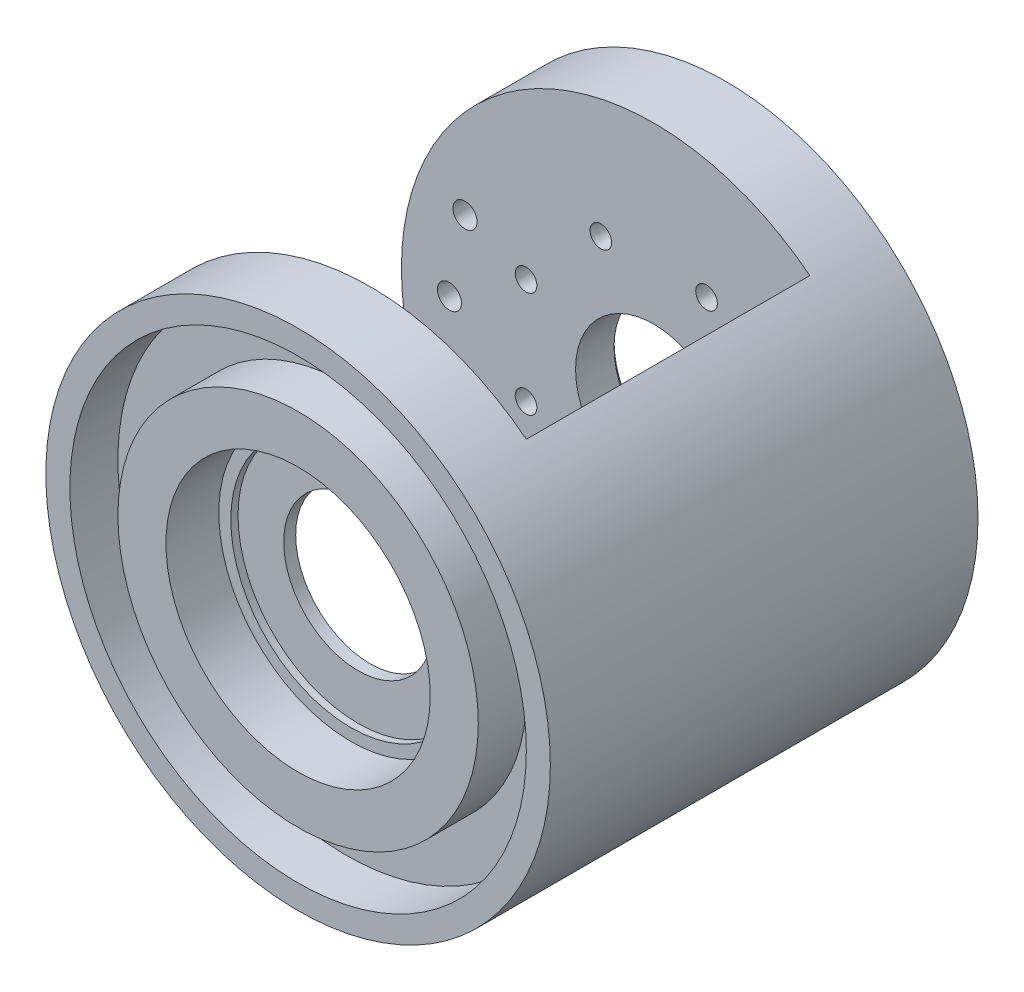
ISO-10303-21;
HEADER;
FILE_DESCRIPTION(('STEP AP214'),'2;1');
FILE_NAME('part.step','',(''),(''),'','','');
FILE_SCHEMA(('AUTOMOTIVE_DESIGN { 1 0 10303 214 1 1 1 1 }'));
ENDSEC;
DATA;
#1=APPLICATION_CONTEXT('core data for automotive mechanical design processes');
#2=APPLICATION_PROTOCOL_DEFINITION('international standard','automotive_design',2000,#1);
#3=PRODUCT_CONTEXT('',#1,'mechanical');
#4=PRODUCT('Part','Part','',(#3));
#5=PRODUCT_RELATED_PRODUCT_CATEGORY('part','',(#4));
#6=PRODUCT_DEFINITION_FORMATION('','',#4);
#7=PRODUCT_DEFINITION_CONTEXT('part definition',#1,'design');
#8=PRODUCT_DEFINITION('design','',#6,#7);
#9=PRODUCT_DEFINITION_SHAPE('','',#8);
#10=(LENGTH_UNIT() NAMED_UNIT(*) SI_UNIT(.MILLI.,.METRE.));
#11=(NAMED_UNIT(*) PLANE_ANGLE_UNIT() SI_UNIT($,.RADIAN.));
#12=(NAMED_UNIT(*) SI_UNIT($,.STERADIAN.) SOLID_ANGLE_UNIT());
#13=UNCERTAINTY_MEASURE_WITH_UNIT(LENGTH_MEASURE(1.E-05),#10,'distance_accuracy_value','');
#14=(GEOMETRIC_REPRESENTATION_CONTEXT(3) GLOBAL_UNCERTAINTY_ASSIGNED_CONTEXT((#13)) GLOBAL_UNIT_ASSIGNED_CONTEXT((#10,
#11,#12)) REPRESENTATION_CONTEXT('',''));
#15=CARTESIAN_POINT('',(0.,0.,0.));
#16=DIRECTION('',(0.,0.,1.));
#17=DIRECTION('',(1.,0.,0.));
#18=AXIS2_PLACEMENT_3D('',#15,#16,#17);
#19=CARTESIAN_POINT('',(0.,0.,178.));
#20=DIRECTION('',(0.,0.,-1.));
#21=DIRECTION('',(-1.,0.,0.));
#22=AXIS2_PLACEMENT_3D('',#19,#20,#21);
#23=CYLINDRICAL_SURFACE('',#22,105.);
#24=CARTESIAN_POINT('',(0.,0.,0.));
#25=DIRECTION('',(0.,0.,1.));
#26=DIRECTION('',(1.,0.,0.));
#27=AXIS2_PLACEMENT_3D('',#24,#25,#26);
#28=CIRCLE('',#27,105.);
#29=CARTESIAN_POINT('',(105.,0.,0.));
#30=VERTEX_POINT('',#29);
#31=EDGE_CURVE('E170',#30,#30,#28,.T.);
#32=ORIENTED_EDGE('',*,*,#31,.T.);
#33=EDGE_LOOP('',(#32));
#34=FACE_BOUND('',#33,.T.);
#35=CARTESIAN_POINT('',(0.,0.,178.));
#36=DIRECTION('',(0.,0.,1.));
#37=DIRECTION('',(1.,0.,0.));
#38=AXIS2_PLACEMENT_3D('',#35,#36,#37);
#39=CIRCLE('',#38,105.);
#40=CARTESIAN_POINT('',(105.,0.,178.));
#41=VERTEX_POINT('',#40);
#42=EDGE_CURVE('E173',#41,#41,#39,.T.);
#43=ORIENTED_EDGE('',*,*,#42,.F.);
#44=EDGE_LOOP('',(#43));
#45=FACE_BOUND('',#44,.T.);
#46=CARTESIAN_POINT('',(0.,0.,148.));
#47=DIRECTION('',(0.,0.,-1.));
#48=DIRECTION('',(-1.,0.,0.));
#49=AXIS2_PLACEMENT_3D('',#46,#47,#48);
#50=CIRCLE('',#49,105.);
#51=CARTESIAN_POINT('',(65.,-82.4621125123532,148.));
#52=VERTEX_POINT('',#51);
#53=CARTESIAN_POINT('',(65.,82.4621125123532,148.));
#54=VERTEX_POINT('',#53);
#55=EDGE_CURVE('E72',#52,#54,#50,.T.);
#56=ORIENTED_EDGE('',*,*,#55,.F.);
#57=DIRECTION('',(0.,0.,-1.));
#58=VECTOR('',#57,1.);
#59=CARTESIAN_POINT('',(65.,-82.4621125123532,148.));
#60=LINE('',#59,#58);
#61=CARTESIAN_POINT('',(65.,-82.4621125123532,30.));
#62=VERTEX_POINT('',#61);
#63=EDGE_CURVE('E60',#52,#62,#60,.T.);
#64=ORIENTED_EDGE('',*,*,#63,.T.);
#65=CARTESIAN_POINT('',(0.,0.,30.));
#66=DIRECTION('',(0.,0.,-1.));
#67=DIRECTION('',(-1.,0.,0.));
#68=AXIS2_PLACEMENT_3D('',#65,#66,#67);
#69=CIRCLE('',#68,105.);
#70=CARTESIAN_POINT('',(65.,82.4621125123532,30.));
#71=VERTEX_POINT('',#70);
#72=EDGE_CURVE('E64',#62,#71,#69,.T.);
#73=ORIENTED_EDGE('',*,*,#72,.T.);
#74=DIRECTION('',(0.,0.,-1.));
#75=VECTOR('',#74,1.);
#76=CARTESIAN_POINT('',(65.,82.4621125123532,148.));
#77=LINE('',#76,#75);
#78=EDGE_CURVE('E62',#54,#71,#77,.T.);
#79=ORIENTED_EDGE('',*,*,#78,.F.);
#80=EDGE_LOOP('',(#56,#64,#73,#79));
#81=FACE_BOUND('',#80,.T.);
#82=ADVANCED_FACE('F32',(#34,#45,#81),#23,.T.);
#83=CARTESIAN_POINT('',(0.,0.,130.));
#84=DIRECTION('',(0.,0.,1.));
#85=DIRECTION('',(1.,0.,0.));
#86=AXIS2_PLACEMENT_3D('',#83,#84,#85);
#87=CYLINDRICAL_SURFACE('',#86,31.);
#88=CARTESIAN_POINT('',(0.,0.,153.));
#89=DIRECTION('',(0.,0.,1.));
#90=DIRECTION('',(1.,0.,0.));
#91=AXIS2_PLACEMENT_3D('',#88,#89,#90);
#92=CIRCLE('',#91,31.);
#93=CARTESIAN_POINT('',(31.,0.,153.));
#94=VERTEX_POINT('',#93);
#95=EDGE_CURVE('E143',#94,#94,#92,.T.);
#96=ORIENTED_EDGE('',*,*,#95,.T.);
#97=EDGE_LOOP('',(#96));
#98=FACE_BOUND('',#97,.T.);
#99=CARTESIAN_POINT('',(0.,0.,148.));
#100=DIRECTION('',(0.,0.,-1.));
#101=DIRECTION('',(-1.,0.,0.));
#102=AXIS2_PLACEMENT_3D('',#99,#100,#101);
#103=CIRCLE('',#102,31.);
#104=CARTESIAN_POINT('',(-31.,0.,148.));
#105=VERTEX_POINT('',#104);
#106=EDGE_CURVE('E102',#105,#105,#103,.F.);
#107=ORIENTED_EDGE('',*,*,#106,.F.);
#108=EDGE_LOOP('',(#107));
#109=FACE_BOUND('',#108,.T.);
#110=ADVANCED_FACE('F209',(#98,#109),#87,.F.);
#111=CARTESIAN_POINT('',(0.,0.,178.));
#112=DIRECTION('',(0.,0.,1.));
#113=DIRECTION('',(1.,0.,0.));
#114=AXIS2_PLACEMENT_3D('',#111,#112,#113);
#115=PLANE('',#114);
#116=CARTESIAN_POINT('',(0.,0.,178.));
#117=DIRECTION('',(0.,0.,1.));
#118=DIRECTION('',(1.,0.,0.));
#119=AXIS2_PLACEMENT_3D('',#116,#117,#118);
#120=CIRCLE('',#119,95.);
#121=CARTESIAN_POINT('',(95.,0.,178.));
#122=VERTEX_POINT('',#121);
#123=EDGE_CURVE('E164',#122,#122,#120,.T.);
#124=ORIENTED_EDGE('',*,*,#123,.F.);
#125=EDGE_LOOP('',(#124));
#126=FACE_BOUND('',#125,.T.);
#127=ORIENTED_EDGE('',*,*,#42,.T.);
#128=EDGE_LOOP('',(#127));
#129=FACE_BOUND('',#128,.T.);
#130=ADVANCED_FACE('F214',(#126,#129),#115,.T.);
#131=CARTESIAN_POINT('',(0.,0.,0.));
#132=DIRECTION('',(0.,0.,1.));
#133=DIRECTION('',(1.,0.,0.));
#134=AXIS2_PLACEMENT_3D('',#131,#132,#133);
#135=PLANE('',#134);
#136=CARTESIAN_POINT('',(0.,0.,0.));
#137=DIRECTION('',(0.,0.,-1.));
#138=DIRECTION('',(-1.,0.,0.));
#139=AXIS2_PLACEMENT_3D('',#136,#137,#138);
#140=CIRCLE('',#139,95.);
#141=CARTESIAN_POINT('',(-95.,0.,0.));
#142=VERTEX_POINT('',#141);
#143=EDGE_CURVE('E137',#142,#142,#140,.T.);
#144=ORIENTED_EDGE('',*,*,#143,.F.);
#145=EDGE_LOOP('',(#144));
#146=FACE_BOUND('',#145,.T.);
#147=ORIENTED_EDGE('',*,*,#31,.F.);
#148=EDGE_LOOP('',(#147));
#149=FACE_BOUND('',#148,.T.);
#150=ADVANCED_FACE('F219',(#146,#149),#135,.F.);
#151=CARTESIAN_POINT('',(0.,0.,158.));
#152=DIRECTION('',(0.,0.,1.));
#153=DIRECTION('',(1.,0.,0.));
#154=AXIS2_PLACEMENT_3D('',#151,#152,#153);
#155=CYLINDRICAL_SURFACE('',#154,95.);
#156=CARTESIAN_POINT('',(0.,0.,158.));
#157=DIRECTION('',(0.,0.,1.));
#158=DIRECTION('',(1.,0.,0.));
#159=AXIS2_PLACEMENT_3D('',#156,#157,#158);
#160=CIRCLE('',#159,95.);
#161=CARTESIAN_POINT('',(95.,0.,158.));
#162=VERTEX_POINT('',#161);
#163=EDGE_CURVE('E167',#162,#162,#160,.T.);
#164=ORIENTED_EDGE('',*,*,#163,.F.);
#165=EDGE_LOOP('',(#164));
#166=FACE_BOUND('',#165,.T.);
#167=ORIENTED_EDGE('',*,*,#123,.T.);
#168=EDGE_LOOP('',(#167));
#169=FACE_BOUND('',#168,.T.);
#170=ADVANCED_FACE('F222',(#166,#169),#155,.F.);
#171=CARTESIAN_POINT('',(0.,0.,158.));
#172=DIRECTION('',(0.,0.,1.));
#173=DIRECTION('',(1.,0.,0.));
#174=AXIS2_PLACEMENT_3D('',#171,#172,#173);
#175=PLANE('',#174);
#176=CARTESIAN_POINT('',(0.,0.,158.));
#177=DIRECTION('',(0.,0.,1.));
#178=DIRECTION('',(1.,0.,0.));
#179=AXIS2_PLACEMENT_3D('',#176,#177,#178);
#180=CIRCLE('',#179,75.);
#181=CARTESIAN_POINT('',(75.,0.,158.));
#182=VERTEX_POINT('',#181);
#183=EDGE_CURVE('E161',#182,#182,#180,.T.);
#184=ORIENTED_EDGE('',*,*,#183,.F.);
#185=EDGE_LOOP('',(#184));
#186=FACE_BOUND('',#185,.T.);
#187=ORIENTED_EDGE('',*,*,#163,.T.);
#188=EDGE_LOOP('',(#187));
#189=FACE_BOUND('',#188,.T.);
#190=ADVANCED_FACE('F231',(#186,#189),#175,.T.);
#191=CARTESIAN_POINT('',(0.,0.,158.));
#192=DIRECTION('',(0.,0.,1.));
#193=DIRECTION('',(1.,0.,0.));
#194=AXIS2_PLACEMENT_3D('',#191,#192,#193);
#195=CYLINDRICAL_SURFACE('',#194,75.);
#196=ORIENTED_EDGE('',*,*,#183,.T.);
#197=EDGE_LOOP('',(#196));
#198=FACE_BOUND('',#197,.T.);
#199=CARTESIAN_POINT('',(0.,0.,178.));
#200=DIRECTION('',(0.,0.,1.));
#201=DIRECTION('',(1.,0.,0.));
#202=AXIS2_PLACEMENT_3D('',#199,#200,#201);
#203=CIRCLE('',#202,75.);
#204=CARTESIAN_POINT('',(75.,0.,178.));
#205=VERTEX_POINT('',#204);
#206=EDGE_CURVE('E158',#205,#205,#203,.T.);
#207=ORIENTED_EDGE('',*,*,#206,.F.);
#208=EDGE_LOOP('',(#207));
#209=FACE_BOUND('',#208,.T.);
#210=ADVANCED_FACE('F235',(#198,#209),#195,.T.);
#211=CARTESIAN_POINT('',(0.,0.,178.));
#212=DIRECTION('',(0.,0.,1.));
#213=DIRECTION('',(1.,0.,0.));
#214=AXIS2_PLACEMENT_3D('',#211,#212,#213);
#215=CIRCLE('',#214,55.);
#216=CARTESIAN_POINT('',(55.,0.,178.));
#217=VERTEX_POINT('',#216);
#218=EDGE_CURVE('E152',#217,#217,#215,.T.);
#219=ORIENTED_EDGE('',*,*,#218,.F.);
#220=EDGE_LOOP('',(#219));
#221=FACE_BOUND('',#220,.T.);
#222=ORIENTED_EDGE('',*,*,#206,.T.);
#223=EDGE_LOOP('',(#222));
#224=FACE_BOUND('',#223,.T.);
#225=ADVANCED_FACE('F228',(#221,#224),#115,.T.);
#226=CARTESIAN_POINT('',(0.,0.,156.));
#227=DIRECTION('',(0.,0.,1.));
#228=DIRECTION('',(1.,0.,0.));
#229=AXIS2_PLACEMENT_3D('',#226,#227,#228);
#230=CYLINDRICAL_SURFACE('',#229,55.);
#231=CARTESIAN_POINT('',(0.,0.,156.));
#232=DIRECTION('',(0.,0.,1.));
#233=DIRECTION('',(1.,0.,0.));
#234=AXIS2_PLACEMENT_3D('',#231,#232,#233);
#235=CIRCLE('',#234,55.);
#236=CARTESIAN_POINT('',(55.,0.,156.));
#237=VERTEX_POINT('',#236);
#238=EDGE_CURVE('E155',#237,#237,#235,.T.);
#239=ORIENTED_EDGE('',*,*,#238,.F.);
#240=EDGE_LOOP('',(#239));
#241=FACE_BOUND('',#240,.T.);
#242=ORIENTED_EDGE('',*,*,#218,.T.);
#243=EDGE_LOOP('',(#242));
#244=FACE_BOUND('',#243,.T.);
#245=ADVANCED_FACE('F240',(#241,#244),#230,.F.);
#246=CARTESIAN_POINT('',(0.,0.,156.));
#247=DIRECTION('',(0.,0.,1.));
#248=DIRECTION('',(1.,0.,0.));
#249=AXIS2_PLACEMENT_3D('',#246,#247,#248);
#250=PLANE('',#249);
#251=CARTESIAN_POINT('',(0.,0.,156.));
#252=DIRECTION('',(0.,0.,1.));
#253=DIRECTION('',(1.,0.,0.));
#254=AXIS2_PLACEMENT_3D('',#251,#252,#253);
#255=CIRCLE('',#254,50.);
#256=CARTESIAN_POINT('',(50.,0.,156.));
#257=VERTEX_POINT('',#256);
#258=EDGE_CURVE('E148',#257,#257,#255,.T.);
#259=ORIENTED_EDGE('',*,*,#258,.F.);
#260=EDGE_LOOP('',(#259));
#261=FACE_BOUND('',#260,.T.);
#262=ORIENTED_EDGE('',*,*,#238,.T.);
#263=EDGE_LOOP('',(#262));
#264=FACE_BOUND('',#263,.T.);
#265=ADVANCED_FACE('F243',(#261,#264),#250,.T.);
#266=CARTESIAN_POINT('',(0.,0.,153.));
#267=DIRECTION('',(0.,0.,1.));
#268=DIRECTION('',(1.,0.,0.));
#269=AXIS2_PLACEMENT_3D('',#266,#267,#268);
#270=CYLINDRICAL_SURFACE('',#269,50.);
#271=CARTESIAN_POINT('',(0.,0.,153.));
#272=DIRECTION('',(0.,0.,1.));
#273=DIRECTION('',(1.,0.,0.));
#274=AXIS2_PLACEMENT_3D('',#271,#272,#273);
#275=CIRCLE('',#274,50.);
#276=CARTESIAN_POINT('',(50.,0.,153.));
#277=VERTEX_POINT('',#276);
#278=EDGE_CURVE('E149',#277,#277,#275,.T.);
#279=ORIENTED_EDGE('',*,*,#278,.F.);
#280=EDGE_LOOP('',(#279));
#281=FACE_BOUND('',#280,.T.);
#282=ORIENTED_EDGE('',*,*,#258,.T.);
#283=EDGE_LOOP('',(#282));
#284=FACE_BOUND('',#283,.T.);
#285=ADVANCED_FACE('F247',(#281,#284),#270,.F.);
#286=CARTESIAN_POINT('',(0.,0.,153.));
#287=DIRECTION('',(0.,0.,1.));
#288=DIRECTION('',(1.,0.,0.));
#289=AXIS2_PLACEMENT_3D('',#286,#287,#288);
#290=PLANE('',#289);
#291=ORIENTED_EDGE('',*,*,#95,.F.);
#292=EDGE_LOOP('',(#291));
#293=FACE_BOUND('',#292,.T.);
#294=ORIENTED_EDGE('',*,*,#278,.T.);
#295=EDGE_LOOP('',(#294));
#296=FACE_BOUND('',#295,.T.);
#297=ADVANCED_FACE('F251',(#293,#296),#290,.T.);
#298=CARTESIAN_POINT('',(0.,0.,20.));
#299=DIRECTION('',(0.,0.,-1.));
#300=DIRECTION('',(-1.,0.,0.));
#301=AXIS2_PLACEMENT_3D('',#298,#299,#300);
#302=CYLINDRICAL_SURFACE('',#301,95.);
#303=CARTESIAN_POINT('',(0.,0.,20.));
#304=DIRECTION('',(0.,0.,-1.));
#305=DIRECTION('',(-1.,0.,0.));
#306=AXIS2_PLACEMENT_3D('',#303,#304,#305);
#307=CIRCLE('',#306,95.);
#308=CARTESIAN_POINT('',(-95.,0.,20.));
#309=VERTEX_POINT('',#308);
#310=EDGE_CURVE('E140',#309,#309,#307,.T.);
#311=ORIENTED_EDGE('',*,*,#310,.F.);
#312=EDGE_LOOP('',(#311));
#313=FACE_BOUND('',#312,.T.);
#314=ORIENTED_EDGE('',*,*,#143,.T.);
#315=EDGE_LOOP('',(#314));
#316=FACE_BOUND('',#315,.T.);
#317=ADVANCED_FACE('F254',(#313,#316),#302,.F.);
#318=CARTESIAN_POINT('',(0.,0.,20.));
#319=DIRECTION('',(0.,0.,-1.));
#320=DIRECTION('',(-1.,0.,0.));
#321=AXIS2_PLACEMENT_3D('',#318,#319,#320);
#322=PLANE('',#321);
#323=CARTESIAN_POINT('',(-78.5297602634595,-32.5280917510324,20.));
#324=DIRECTION('',(0.,0.,-1.));
#325=DIRECTION('',(-1.,0.,0.));
#326=AXIS2_PLACEMENT_3D('',#323,#324,#325);
#327=CIRCLE('',#326,5.00000000000001);
#328=CARTESIAN_POINT('',(-83.5297602634595,-32.5280917510324,20.));
#329=VERTEX_POINT('',#328);
#330=EDGE_CURVE('E189',#329,#329,#327,.T.);
#331=ORIENTED_EDGE('',*,*,#330,.F.);
#332=EDGE_LOOP('',(#331));
#333=FACE_BOUND('',#332,.T.);
#334=CARTESIAN_POINT('',(-78.5297602634595,32.5280917510324,20.));
#335=DIRECTION('',(0.,0.,-1.));
#336=DIRECTION('',(-1.,0.,0.));
#337=AXIS2_PLACEMENT_3D('',#334,#335,#336);
#338=CIRCLE('',#337,5.00000000000001);
#339=CARTESIAN_POINT('',(-83.5297602634595,32.5280917510324,20.));
#340=VERTEX_POINT('',#339);
#341=EDGE_CURVE('E185',#340,#340,#338,.T.);
#342=ORIENTED_EDGE('',*,*,#341,.F.);
#343=EDGE_LOOP('',(#342));
#344=FACE_BOUND('',#343,.T.);
#345=CARTESIAN_POINT('',(-85.,0.,20.));
#346=DIRECTION('',(0.,0.,-1.));
#347=DIRECTION('',(-1.,0.,0.));
#348=AXIS2_PLACEMENT_3D('',#345,#346,#347);
#349=CIRCLE('',#348,5.);
#350=CARTESIAN_POINT('',(-90.,0.,20.));
#351=VERTEX_POINT('',#350);
#352=EDGE_CURVE('E69',#351,#351,#349,.T.);
#353=ORIENTED_EDGE('',*,*,#352,.F.);
#354=EDGE_LOOP('',(#353));
#355=FACE_BOUND('',#354,.T.);
#356=CARTESIAN_POINT('',(0.,0.,20.));
#357=DIRECTION('',(0.,0.,-1.));
#358=DIRECTION('',(-1.,0.,0.));
#359=AXIS2_PLACEMENT_3D('',#356,#357,#358);
#360=CIRCLE('',#359,75.);
#361=CARTESIAN_POINT('',(-75.,0.,20.));
#362=VERTEX_POINT('',#361);
#363=EDGE_CURVE('E134',#362,#362,#360,.T.);
#364=ORIENTED_EDGE('',*,*,#363,.F.);
#365=EDGE_LOOP('',(#364));
#366=FACE_BOUND('',#365,.T.);
#367=ORIENTED_EDGE('',*,*,#310,.T.);
#368=EDGE_LOOP('',(#367));
#369=FACE_BOUND('',#368,.T.);
#370=ADVANCED_FACE('F259',(#333,#344,#355,#366,#369),#322,.T.);
#371=CARTESIAN_POINT('',(0.,0.,20.));
#372=DIRECTION('',(0.,0.,-1.));
#373=DIRECTION('',(-1.,0.,0.));
#374=AXIS2_PLACEMENT_3D('',#371,#372,#373);
#375=CYLINDRICAL_SURFACE('',#374,75.);
#376=ORIENTED_EDGE('',*,*,#363,.T.);
#377=EDGE_LOOP('',(#376));
#378=FACE_BOUND('',#377,.T.);
#379=CARTESIAN_POINT('',(0.,0.,0.));
#380=DIRECTION('',(0.,0.,-1.));
#381=DIRECTION('',(-1.,0.,0.));
#382=AXIS2_PLACEMENT_3D('',#379,#380,#381);
#383=CIRCLE('',#382,75.);
#384=CARTESIAN_POINT('',(-75.,0.,0.));
#385=VERTEX_POINT('',#384);
#386=EDGE_CURVE('E131',#385,#385,#383,.T.);
#387=ORIENTED_EDGE('',*,*,#386,.F.);
#388=EDGE_LOOP('',(#387));
#389=FACE_BOUND('',#388,.T.);
#390=ADVANCED_FACE('F263',(#378,#389),#375,.T.);
#391=CARTESIAN_POINT('',(0.,0.,0.));
#392=DIRECTION('',(0.,0.,-1.));
#393=DIRECTION('',(-1.,0.,0.));
#394=AXIS2_PLACEMENT_3D('',#391,#392,#393);
#395=CIRCLE('',#394,67.5);
#396=CARTESIAN_POINT('',(-67.5,0.,0.));
#397=VERTEX_POINT('',#396);
#398=EDGE_CURVE('E127',#397,#397,#395,.T.);
#399=ORIENTED_EDGE('',*,*,#398,.F.);
#400=EDGE_LOOP('',(#399));
#401=FACE_BOUND('',#400,.T.);
#402=ORIENTED_EDGE('',*,*,#386,.T.);
#403=EDGE_LOOP('',(#402));
#404=FACE_BOUND('',#403,.T.);
#405=ADVANCED_FACE('F224',(#401,#404),#135,.F.);
#406=CARTESIAN_POINT('',(0.,0.,12.));
#407=DIRECTION('',(0.,0.,-1.));
#408=DIRECTION('',(-1.,0.,0.));
#409=AXIS2_PLACEMENT_3D('',#406,#407,#408);
#410=CYLINDRICAL_SURFACE('',#409,67.5);
#411=CARTESIAN_POINT('',(0.,0.,12.));
#412=DIRECTION('',(0.,0.,-1.));
#413=DIRECTION('',(-1.,0.,0.));
#414=AXIS2_PLACEMENT_3D('',#411,#412,#413);
#415=CIRCLE('',#414,67.5);
#416=CARTESIAN_POINT('',(-67.5,0.,12.));
#417=VERTEX_POINT('',#416);
#418=EDGE_CURVE('E128',#417,#417,#415,.T.);
#419=ORIENTED_EDGE('',*,*,#418,.F.);
#420=EDGE_LOOP('',(#419));
#421=FACE_BOUND('',#420,.T.);
#422=ORIENTED_EDGE('',*,*,#398,.T.);
#423=EDGE_LOOP('',(#422));
#424=FACE_BOUND('',#423,.T.);
#425=ADVANCED_FACE('F268',(#421,#424),#410,.F.);
#426=CARTESIAN_POINT('',(0.,0.,12.));
#427=DIRECTION('',(0.,0.,-1.));
#428=DIRECTION('',(-1.,0.,0.));
#429=AXIS2_PLACEMENT_3D('',#426,#427,#428);
#430=PLANE('',#429);
#431=CARTESIAN_POINT('',(0.,0.,12.));
#432=DIRECTION('',(0.,0.,-1.));
#433=DIRECTION('',(-1.,0.,0.));
#434=AXIS2_PLACEMENT_3D('',#431,#432,#433);
#435=CIRCLE('',#434,34.5);
#436=CARTESIAN_POINT('',(-34.5,0.,12.));
#437=VERTEX_POINT('',#436);
#438=EDGE_CURVE('E11',#437,#437,#435,.F.);
#439=ORIENTED_EDGE('',*,*,#438,.T.);
#440=EDGE_LOOP('',(#439));
#441=FACE_BOUND('',#440,.T.);
#442=CARTESIAN_POINT('',(22.004297360992,53.1230731193993,12.));
#443=DIRECTION('',(0.,0.,-1.));
#444=DIRECTION('',(-1.,0.,0.));
#445=AXIS2_PLACEMENT_3D('',#442,#443,#444);
#446=CIRCLE('',#445,4.50000000000001);
#447=CARTESIAN_POINT('',(17.504297360992,53.1230731193993,12.));
#448=VERTEX_POINT('',#447);
#449=EDGE_CURVE('E103',#448,#448,#446,.T.);
#450=ORIENTED_EDGE('',*,*,#449,.F.);
#451=EDGE_LOOP('',(#450));
#452=FACE_BOUND('',#451,.T.);
#453=CARTESIAN_POINT('',(53.1230731193985,22.0042973609916,12.));
#454=DIRECTION('',(0.,0.,-1.));
#455=DIRECTION('',(-1.,0.,0.));
#456=AXIS2_PLACEMENT_3D('',#453,#454,#455);
#457=CIRCLE('',#456,4.50000000000167);
#458=CARTESIAN_POINT('',(48.6230731193968,22.0042973609916,12.));
#459=VERTEX_POINT('',#458);
#460=EDGE_CURVE('E106',#459,#459,#457,.T.);
#461=ORIENTED_EDGE('',*,*,#460,.F.);
#462=EDGE_LOOP('',(#461));
#463=FACE_BOUND('',#462,.T.);
#464=CARTESIAN_POINT('',(53.1230731193979,-22.0042973609937,12.));
#465=DIRECTION('',(0.,0.,-1.));
#466=DIRECTION('',(-1.,0.,0.));
#467=AXIS2_PLACEMENT_3D('',#464,#465,#466);
#468=CIRCLE('',#467,4.5000000000019);
#469=CARTESIAN_POINT('',(48.623073119396,-22.0042973609937,12.));
#470=VERTEX_POINT('',#469);
#471=EDGE_CURVE('E109',#470,#470,#468,.T.);
#472=ORIENTED_EDGE('',*,*,#471,.F.);
#473=EDGE_LOOP('',(#472));
#474=FACE_BOUND('',#473,.T.);
#475=CARTESIAN_POINT('',(22.0042973609912,-53.1230731193996,12.));
#476=DIRECTION('',(0.,0.,-1.));
#477=DIRECTION('',(-1.,0.,0.));
#478=AXIS2_PLACEMENT_3D('',#475,#476,#477);
#479=CIRCLE('',#478,4.50000000000162);
#480=CARTESIAN_POINT('',(17.5042973609895,-53.1230731193996,12.));
#481=VERTEX_POINT('',#480);
#482=EDGE_CURVE('E112',#481,#481,#479,.T.);
#483=ORIENTED_EDGE('',*,*,#482,.F.);
#484=EDGE_LOOP('',(#483));
#485=FACE_BOUND('',#484,.T.);
#486=CARTESIAN_POINT('',(-22.0042973609942,-53.123073119399,12.));
#487=DIRECTION('',(0.,0.,-1.));
#488=DIRECTION('',(-1.,0.,0.));
#489=AXIS2_PLACEMENT_3D('',#486,#487,#488);
#490=CIRCLE('',#489,4.50000000000098);
#491=CARTESIAN_POINT('',(-26.5042973609951,-53.123073119399,12.));
#492=VERTEX_POINT('',#491);
#493=EDGE_CURVE('E115',#492,#492,#490,.T.);
#494=ORIENTED_EDGE('',*,*,#493,.F.);
#495=EDGE_LOOP('',(#494));
#496=FACE_BOUND('',#495,.T.);
#497=CARTESIAN_POINT('',(-53.1230731194001,-22.0042973609923,12.));
#498=DIRECTION('',(0.,0.,-1.));
#499=DIRECTION('',(-1.,0.,0.));
#500=AXIS2_PLACEMENT_3D('',#497,#498,#499);
#501=CIRCLE('',#500,4.50000000000028);
#502=CARTESIAN_POINT('',(-57.6230731194003,-22.0042973609923,12.));
#503=VERTEX_POINT('',#502);
#504=EDGE_CURVE('E118',#503,#503,#501,.T.);
#505=ORIENTED_EDGE('',*,*,#504,.F.);
#506=EDGE_LOOP('',(#505));
#507=FACE_BOUND('',#506,.T.);
#508=CARTESIAN_POINT('',(-53.123073119399,22.0042973609925,12.));
#509=DIRECTION('',(0.,0.,-1.));
#510=DIRECTION('',(-1.,0.,0.));
#511=AXIS2_PLACEMENT_3D('',#508,#509,#510);
#512=CIRCLE('',#511,4.5);
#513=CARTESIAN_POINT('',(-57.623073119399,22.0042973609925,12.));
#514=VERTEX_POINT('',#513);
#515=EDGE_CURVE('E121',#514,#514,#512,.T.);
#516=ORIENTED_EDGE('',*,*,#515,.F.);
#517=EDGE_LOOP('',(#516));
#518=FACE_BOUND('',#517,.T.);
#519=CARTESIAN_POINT('',(-22.0042973609927,53.123073119399,12.));
#520=DIRECTION('',(0.,0.,-1.));
#521=DIRECTION('',(-1.,0.,0.));
#522=AXIS2_PLACEMENT_3D('',#519,#520,#521);
#523=CIRCLE('',#522,4.5);
#524=CARTESIAN_POINT('',(-26.5042973609927,53.123073119399,12.));
#525=VERTEX_POINT('',#524);
#526=EDGE_CURVE('E124',#525,#525,#523,.T.);
#527=ORIENTED_EDGE('',*,*,#526,.F.);
#528=EDGE_LOOP('',(#527));
#529=FACE_BOUND('',#528,.T.);
#530=ORIENTED_EDGE('',*,*,#418,.T.);
#531=EDGE_LOOP('',(#530));
#532=FACE_BOUND('',#531,.T.);
#533=ADVANCED_FACE('F271',(#441,#452,#463,#474,#485,#496,#507,#518,#529,#532),#430,.T.);
#534=CARTESIAN_POINT('',(0.,0.,32.));
#535=DIRECTION('',(0.,0.,-1.));
#536=DIRECTION('',(-1.,0.,0.));
#537=AXIS2_PLACEMENT_3D('',#534,#535,#536);
#538=CYLINDRICAL_SURFACE('',#537,32.5);
#539=CARTESIAN_POINT('',(0.,0.,14.));
#540=DIRECTION('',(0.,0.,-1.));
#541=DIRECTION('',(-1.,0.,0.));
#542=AXIS2_PLACEMENT_3D('',#539,#540,#541);
#543=CIRCLE('',#542,32.5);
#544=CARTESIAN_POINT('',(-32.5,0.,14.));
#545=VERTEX_POINT('',#544);
#546=EDGE_CURVE('E40',#545,#545,#543,.T.);
#547=ORIENTED_EDGE('',*,*,#546,.T.);
#548=EDGE_LOOP('',(#547));
#549=FACE_BOUND('',#548,.T.);
#550=CARTESIAN_POINT('',(0.,0.,30.));
#551=DIRECTION('',(0.,0.,-1.));
#552=DIRECTION('',(-1.,0.,0.));
#553=AXIS2_PLACEMENT_3D('',#550,#551,#552);
#554=CIRCLE('',#553,32.5);
#555=CARTESIAN_POINT('',(-32.5,0.,30.));
#556=VERTEX_POINT('',#555);
#557=EDGE_CURVE('E99',#556,#556,#554,.F.);
#558=ORIENTED_EDGE('',*,*,#557,.T.);
#559=EDGE_LOOP('',(#558));
#560=FACE_BOUND('',#559,.T.);
#561=ADVANCED_FACE('F195',(#549,#560),#538,.F.);
#562=CARTESIAN_POINT('',(-22.0042973609927,53.123073119399,42.));
#563=DIRECTION('',(0.,0.,-1.));
#564=DIRECTION('',(-1.,0.,0.));
#565=AXIS2_PLACEMENT_3D('',#562,#563,#564);
#566=CYLINDRICAL_SURFACE('',#565,4.5);
#567=CARTESIAN_POINT('',(-22.0042973609927,53.123073119399,30.));
#568=DIRECTION('',(0.,0.,-1.));
#569=DIRECTION('',(-1.,0.,0.));
#570=AXIS2_PLACEMENT_3D('',#567,#568,#569);
#571=CIRCLE('',#570,4.5);
#572=CARTESIAN_POINT('',(-26.5042973609927,53.123073119399,30.));
#573=VERTEX_POINT('',#572);
#574=EDGE_CURVE('E96',#573,#573,#571,.F.);
#575=ORIENTED_EDGE('',*,*,#574,.T.);
#576=EDGE_LOOP('',(#575));
#577=FACE_BOUND('',#576,.T.);
#578=ORIENTED_EDGE('',*,*,#526,.T.);
#579=EDGE_LOOP('',(#578));
#580=FACE_BOUND('',#579,.T.);
#581=ADVANCED_FACE('F278',(#577,#580),#566,.F.);
#582=CARTESIAN_POINT('',(-53.123073119399,22.0042973609925,42.));
#583=DIRECTION('',(0.,0.,-1.));
#584=DIRECTION('',(-1.,0.,0.));
#585=AXIS2_PLACEMENT_3D('',#582,#583,#584);
#586=CYLINDRICAL_SURFACE('',#585,4.5);
#587=CARTESIAN_POINT('',(-53.123073119399,22.0042973609925,30.));
#588=DIRECTION('',(0.,0.,-1.));
#589=DIRECTION('',(-1.,0.,0.));
#590=AXIS2_PLACEMENT_3D('',#587,#588,#589);
#591=CIRCLE('',#590,4.5);
#592=CARTESIAN_POINT('',(-57.623073119399,22.0042973609925,30.));
#593=VERTEX_POINT('',#592);
#594=EDGE_CURVE('E93',#593,#593,#591,.F.);
#595=ORIENTED_EDGE('',*,*,#594,.T.);
#596=EDGE_LOOP('',(#595));
#597=FACE_BOUND('',#596,.T.);
#598=ORIENTED_EDGE('',*,*,#515,.T.);
#599=EDGE_LOOP('',(#598));
#600=FACE_BOUND('',#599,.T.);
#601=ADVANCED_FACE('F281',(#597,#600),#586,.F.);
#602=CARTESIAN_POINT('',(-53.1230731194001,-22.0042973609923,42.));
#603=DIRECTION('',(0.,0.,-1.));
#604=DIRECTION('',(-1.,0.,0.));
#605=AXIS2_PLACEMENT_3D('',#602,#603,#604);
#606=CYLINDRICAL_SURFACE('',#605,4.50000000000028);
#607=CARTESIAN_POINT('',(-53.1230731194001,-22.0042973609923,30.));
#608=DIRECTION('',(0.,0.,-1.));
#609=DIRECTION('',(-1.,0.,0.));
#610=AXIS2_PLACEMENT_3D('',#607,#608,#609);
#611=CIRCLE('',#610,4.50000000000028);
#612=CARTESIAN_POINT('',(-57.6230731194003,-22.0042973609923,30.));
#613=VERTEX_POINT('',#612);
#614=EDGE_CURVE('E90',#613,#613,#611,.F.);
#615=ORIENTED_EDGE('',*,*,#614,.T.);
#616=EDGE_LOOP('',(#615));
#617=FACE_BOUND('',#616,.T.);
#618=ORIENTED_EDGE('',*,*,#504,.T.);
#619=EDGE_LOOP('',(#618));
#620=FACE_BOUND('',#619,.T.);
#621=ADVANCED_FACE('F285',(#617,#620),#606,.F.);
#622=CARTESIAN_POINT('',(-22.0042973609942,-53.123073119399,42.));
#623=DIRECTION('',(0.,0.,-1.));
#624=DIRECTION('',(-1.,0.,0.));
#625=AXIS2_PLACEMENT_3D('',#622,#623,#624);
#626=CYLINDRICAL_SURFACE('',#625,4.50000000000098);
#627=CARTESIAN_POINT('',(-22.0042973609942,-53.123073119399,30.));
#628=DIRECTION('',(0.,0.,-1.));
#629=DIRECTION('',(-1.,0.,0.));
#630=AXIS2_PLACEMENT_3D('',#627,#628,#629);
#631=CIRCLE('',#630,4.50000000000098);
#632=CARTESIAN_POINT('',(-26.5042973609951,-53.123073119399,30.));
#633=VERTEX_POINT('',#632);
#634=EDGE_CURVE('E87',#633,#633,#631,.F.);
#635=ORIENTED_EDGE('',*,*,#634,.T.);
#636=EDGE_LOOP('',(#635));
#637=FACE_BOUND('',#636,.T.);
#638=ORIENTED_EDGE('',*,*,#493,.T.);
#639=EDGE_LOOP('',(#638));
#640=FACE_BOUND('',#639,.T.);
#641=ADVANCED_FACE('F289',(#637,#640),#626,.F.);
#642=CARTESIAN_POINT('',(22.0042973609912,-53.1230731193996,42.));
#643=DIRECTION('',(0.,0.,-1.));
#644=DIRECTION('',(-1.,0.,0.));
#645=AXIS2_PLACEMENT_3D('',#642,#643,#644);
#646=CYLINDRICAL_SURFACE('',#645,4.50000000000162);
#647=CARTESIAN_POINT('',(22.0042973609912,-53.1230731193996,30.));
#648=DIRECTION('',(0.,0.,-1.));
#649=DIRECTION('',(-1.,0.,0.));
#650=AXIS2_PLACEMENT_3D('',#647,#648,#649);
#651=CIRCLE('',#650,4.50000000000162);
#652=CARTESIAN_POINT('',(17.5042973609895,-53.1230731193996,30.));
#653=VERTEX_POINT('',#652);
#654=EDGE_CURVE('E84',#653,#653,#651,.F.);
#655=ORIENTED_EDGE('',*,*,#654,.T.);
#656=EDGE_LOOP('',(#655));
#657=FACE_BOUND('',#656,.T.);
#658=ORIENTED_EDGE('',*,*,#482,.T.);
#659=EDGE_LOOP('',(#658));
#660=FACE_BOUND('',#659,.T.);
#661=ADVANCED_FACE('F293',(#657,#660),#646,.F.);
#662=CARTESIAN_POINT('',(53.1230731193979,-22.0042973609937,42.));
#663=DIRECTION('',(0.,0.,-1.));
#664=DIRECTION('',(-1.,0.,0.));
#665=AXIS2_PLACEMENT_3D('',#662,#663,#664);
#666=CYLINDRICAL_SURFACE('',#665,4.5000000000019);
#667=CARTESIAN_POINT('',(53.1230731193979,-22.0042973609937,30.));
#668=DIRECTION('',(0.,0.,-1.));
#669=DIRECTION('',(-1.,0.,0.));
#670=AXIS2_PLACEMENT_3D('',#667,#668,#669);
#671=CIRCLE('',#670,4.5000000000019);
#672=CARTESIAN_POINT('',(48.623073119396,-22.0042973609937,30.));
#673=VERTEX_POINT('',#672);
#674=EDGE_CURVE('E81',#673,#673,#671,.F.);
#675=ORIENTED_EDGE('',*,*,#674,.T.);
#676=EDGE_LOOP('',(#675));
#677=FACE_BOUND('',#676,.T.);
#678=ORIENTED_EDGE('',*,*,#471,.T.);
#679=EDGE_LOOP('',(#678));
#680=FACE_BOUND('',#679,.T.);
#681=ADVANCED_FACE('F297',(#677,#680),#666,.F.);
#682=CARTESIAN_POINT('',(53.1230731193985,22.0042973609916,42.));
#683=DIRECTION('',(0.,0.,-1.));
#684=DIRECTION('',(-1.,0.,0.));
#685=AXIS2_PLACEMENT_3D('',#682,#683,#684);
#686=CYLINDRICAL_SURFACE('',#685,4.50000000000167);
#687=CARTESIAN_POINT('',(53.1230731193985,22.0042973609916,30.));
#688=DIRECTION('',(0.,0.,-1.));
#689=DIRECTION('',(-1.,0.,0.));
#690=AXIS2_PLACEMENT_3D('',#687,#688,#689);
#691=CIRCLE('',#690,4.50000000000167);
#692=CARTESIAN_POINT('',(48.6230731193968,22.0042973609916,30.));
#693=VERTEX_POINT('',#692);
#694=EDGE_CURVE('E78',#693,#693,#691,.F.);
#695=ORIENTED_EDGE('',*,*,#694,.T.);
#696=EDGE_LOOP('',(#695));
#697=FACE_BOUND('',#696,.T.);
#698=ORIENTED_EDGE('',*,*,#460,.T.);
#699=EDGE_LOOP('',(#698));
#700=FACE_BOUND('',#699,.T.);
#701=ADVANCED_FACE('F301',(#697,#700),#686,.F.);
#702=CARTESIAN_POINT('',(22.004297360992,53.1230731193993,42.));
#703=DIRECTION('',(0.,0.,-1.));
#704=DIRECTION('',(-1.,0.,0.));
#705=AXIS2_PLACEMENT_3D('',#702,#703,#704);
#706=CYLINDRICAL_SURFACE('',#705,4.50000000000001);
#707=CARTESIAN_POINT('',(22.004297360992,53.1230731193993,30.));
#708=DIRECTION('',(0.,0.,-1.));
#709=DIRECTION('',(-1.,0.,0.));
#710=AXIS2_PLACEMENT_3D('',#707,#708,#709);
#711=CIRCLE('',#710,4.50000000000001);
#712=CARTESIAN_POINT('',(17.504297360992,53.1230731193993,30.));
#713=VERTEX_POINT('',#712);
#714=EDGE_CURVE('E74',#713,#713,#711,.F.);
#715=ORIENTED_EDGE('',*,*,#714,.T.);
#716=EDGE_LOOP('',(#715));
#717=FACE_BOUND('',#716,.T.);
#718=ORIENTED_EDGE('',*,*,#449,.T.);
#719=EDGE_LOOP('',(#718));
#720=FACE_BOUND('',#719,.T.);
#721=ADVANCED_FACE('F305',(#717,#720),#706,.F.);
#722=CARTESIAN_POINT('',(0.,0.,148.));
#723=DIRECTION('',(0.,0.,-1.));
#724=DIRECTION('',(-1.,0.,0.));
#725=AXIS2_PLACEMENT_3D('',#722,#723,#724);
#726=PLANE('',#725);
#727=DIRECTION('',(0.,-1.,0.));
#728=VECTOR('',#727,1.);
#729=CARTESIAN_POINT('',(65.,0.,148.));
#730=LINE('',#729,#728);
#731=EDGE_CURVE('E54',#54,#52,#730,.T.);
#732=ORIENTED_EDGE('',*,*,#731,.T.);
#733=ORIENTED_EDGE('',*,*,#55,.T.);
#734=EDGE_LOOP('',(#732,#733));
#735=FACE_BOUND('',#734,.T.);
#736=ORIENTED_EDGE('',*,*,#106,.T.);
#737=EDGE_LOOP('',(#736));
#738=FACE_BOUND('',#737,.T.);
#739=ADVANCED_FACE('F309',(#735,#738),#726,.T.);
#740=CARTESIAN_POINT('',(0.,0.,30.));
#741=DIRECTION('',(0.,0.,-1.));
#742=DIRECTION('',(-1.,0.,0.));
#743=AXIS2_PLACEMENT_3D('',#740,#741,#742);
#744=PLANE('',#743);
#745=CARTESIAN_POINT('',(-78.5297602634595,-32.5280917510324,30.));
#746=DIRECTION('',(0.,0.,-1.));
#747=DIRECTION('',(-1.,0.,0.));
#748=AXIS2_PLACEMENT_3D('',#745,#746,#747);
#749=CIRCLE('',#748,5.00000000000001);
#750=CARTESIAN_POINT('',(-83.5297602634595,-32.5280917510324,30.));
#751=VERTEX_POINT('',#750);
#752=EDGE_CURVE('E190',#751,#751,#749,.T.);
#753=ORIENTED_EDGE('',*,*,#752,.T.);
#754=EDGE_LOOP('',(#753));
#755=FACE_BOUND('',#754,.T.);
#756=CARTESIAN_POINT('',(-78.5297602634595,32.5280917510324,30.));
#757=DIRECTION('',(0.,0.,-1.));
#758=DIRECTION('',(-1.,0.,0.));
#759=AXIS2_PLACEMENT_3D('',#756,#757,#758);
#760=CIRCLE('',#759,5.00000000000001);
#761=CARTESIAN_POINT('',(-83.5297602634595,32.5280917510324,30.));
#762=VERTEX_POINT('',#761);
#763=EDGE_CURVE('E186',#762,#762,#760,.T.);
#764=ORIENTED_EDGE('',*,*,#763,.T.);
#765=EDGE_LOOP('',(#764));
#766=FACE_BOUND('',#765,.T.);
#767=CARTESIAN_POINT('',(-85.,0.,30.));
#768=DIRECTION('',(0.,0.,-1.));
#769=DIRECTION('',(-1.,0.,0.));
#770=AXIS2_PLACEMENT_3D('',#767,#768,#769);
#771=CIRCLE('',#770,5.);
#772=CARTESIAN_POINT('',(-90.,0.,30.));
#773=VERTEX_POINT('',#772);
#774=EDGE_CURVE('E182',#773,#773,#771,.T.);
#775=ORIENTED_EDGE('',*,*,#774,.T.);
#776=EDGE_LOOP('',(#775));
#777=FACE_BOUND('',#776,.T.);
#778=ORIENTED_EDGE('',*,*,#574,.F.);
#779=EDGE_LOOP('',(#778));
#780=FACE_BOUND('',#779,.T.);
#781=ORIENTED_EDGE('',*,*,#614,.F.);
#782=EDGE_LOOP('',(#781));
#783=FACE_BOUND('',#782,.T.);
#784=ORIENTED_EDGE('',*,*,#654,.F.);
#785=EDGE_LOOP('',(#784));
#786=FACE_BOUND('',#785,.T.);
#787=ORIENTED_EDGE('',*,*,#694,.F.);
#788=EDGE_LOOP('',(#787));
#789=FACE_BOUND('',#788,.T.);
#790=DIRECTION('',(0.,-1.,0.));
#791=VECTOR('',#790,1.);
#792=CARTESIAN_POINT('',(65.,0.,30.));
#793=LINE('',#792,#791);
#794=EDGE_CURVE('E46',#71,#62,#793,.T.);
#795=ORIENTED_EDGE('',*,*,#794,.F.);
#796=ORIENTED_EDGE('',*,*,#72,.F.);
#797=EDGE_LOOP('',(#795,#796));
#798=FACE_BOUND('',#797,.T.);
#799=ORIENTED_EDGE('',*,*,#714,.F.);
#800=EDGE_LOOP('',(#799));
#801=FACE_BOUND('',#800,.T.);
#802=ORIENTED_EDGE('',*,*,#674,.F.);
#803=EDGE_LOOP('',(#802));
#804=FACE_BOUND('',#803,.T.);
#805=ORIENTED_EDGE('',*,*,#634,.F.);
#806=EDGE_LOOP('',(#805));
#807=FACE_BOUND('',#806,.T.);
#808=ORIENTED_EDGE('',*,*,#594,.F.);
#809=EDGE_LOOP('',(#808));
#810=FACE_BOUND('',#809,.T.);
#811=ORIENTED_EDGE('',*,*,#557,.F.);
#812=EDGE_LOOP('',(#811));
#813=FACE_BOUND('',#812,.T.);
#814=ADVANCED_FACE('F66',(#755,#766,#777,#780,#783,#786,#789,#798,#801,#804,#807,#810,#813),
#744,.F.);
#815=CARTESIAN_POINT('',(65.,0.,148.));
#816=DIRECTION('',(1.,0.,0.));
#817=DIRECTION('',(0.,1.,0.));
#818=AXIS2_PLACEMENT_3D('',#815,#816,#817);
#819=PLANE('',#818);
#820=ORIENTED_EDGE('',*,*,#794,.T.);
#821=ORIENTED_EDGE('',*,*,#63,.F.);
#822=ORIENTED_EDGE('',*,*,#731,.F.);
#823=ORIENTED_EDGE('',*,*,#78,.T.);
#824=EDGE_LOOP('',(#820,#821,#822,#823));
#825=FACE_BOUND('',#824,.T.);
#826=ADVANCED_FACE('F58',(#825),#819,.F.);
#827=CARTESIAN_POINT('',(-85.,0.,50.));
#828=DIRECTION('',(0.,0.,-1.));
#829=DIRECTION('',(-1.,0.,0.));
#830=AXIS2_PLACEMENT_3D('',#827,#828,#829);
#831=CYLINDRICAL_SURFACE('',#830,5.);
#832=ORIENTED_EDGE('',*,*,#352,.T.);
#833=EDGE_LOOP('',(#832));
#834=FACE_BOUND('',#833,.T.);
#835=ORIENTED_EDGE('',*,*,#774,.F.);
#836=EDGE_LOOP('',(#835));
#837=FACE_BOUND('',#836,.T.);
#838=ADVANCED_FACE('F313',(#834,#837),#831,.F.);
#839=CARTESIAN_POINT('',(-78.5297602634595,32.5280917510324,50.));
#840=DIRECTION('',(0.,0.,-1.));
#841=DIRECTION('',(-1.,0.,0.));
#842=AXIS2_PLACEMENT_3D('',#839,#840,#841);
#843=CYLINDRICAL_SURFACE('',#842,5.00000000000001);
#844=ORIENTED_EDGE('',*,*,#341,.T.);
#845=EDGE_LOOP('',(#844));
#846=FACE_BOUND('',#845,.T.);
#847=ORIENTED_EDGE('',*,*,#763,.F.);
#848=EDGE_LOOP('',(#847));
#849=FACE_BOUND('',#848,.T.);
#850=ADVANCED_FACE('F204',(#846,#849),#843,.F.);
#851=CARTESIAN_POINT('',(-78.5297602634595,-32.5280917510324,50.));
#852=DIRECTION('',(0.,0.,-1.));
#853=DIRECTION('',(-1.,0.,0.));
#854=AXIS2_PLACEMENT_3D('',#851,#852,#853);
#855=CYLINDRICAL_SURFACE('',#854,5.00000000000001);
#856=ORIENTED_EDGE('',*,*,#330,.T.);
#857=EDGE_LOOP('',(#856));
#858=FACE_BOUND('',#857,.T.);
#859=ORIENTED_EDGE('',*,*,#752,.F.);
#860=EDGE_LOOP('',(#859));
#861=FACE_BOUND('',#860,.T.);
#862=ADVANCED_FACE('F199',(#858,#861),#855,.F.);
#863=CARTESIAN_POINT('',(0.,0.,14.));
#864=DIRECTION('',(0.,0.,-1.));
#865=DIRECTION('',(-1.,0.,0.));
#866=AXIS2_PLACEMENT_3D('',#863,#864,#865);
#867=CONICAL_SURFACE('',#866,32.5,0.785398163397457);
#868=ORIENTED_EDGE('',*,*,#438,.F.);
#869=EDGE_LOOP('',(#868));
#870=FACE_BOUND('',#869,.T.);
#871=ORIENTED_EDGE('',*,*,#546,.F.);
#872=EDGE_LOOP('',(#871));
#873=FACE_BOUND('',#872,.T.);
#874=ADVANCED_FACE('F34',(#870,#873),#867,.F.);
#875=CLOSED_SHELL('',(#82,#110,#130,#150,#170,#190,#210,#225,#245,#265,#285,#297,#317,#370,#390,
#405,#425,#533,#561,#581,#601,#621,#641,#661,#681,#701,#721,#739,#814,#826,#838,#850,#862,#874));
#876=MANIFOLD_SOLID_BREP('B2',#875);
#877=ADVANCED_BREP_SHAPE_REPRESENTATION('',(#18,#876),#14);
#878=SHAPE_DEFINITION_REPRESENTATION(#9,#877);
ENDSEC;
END-ISO-10303-21;
